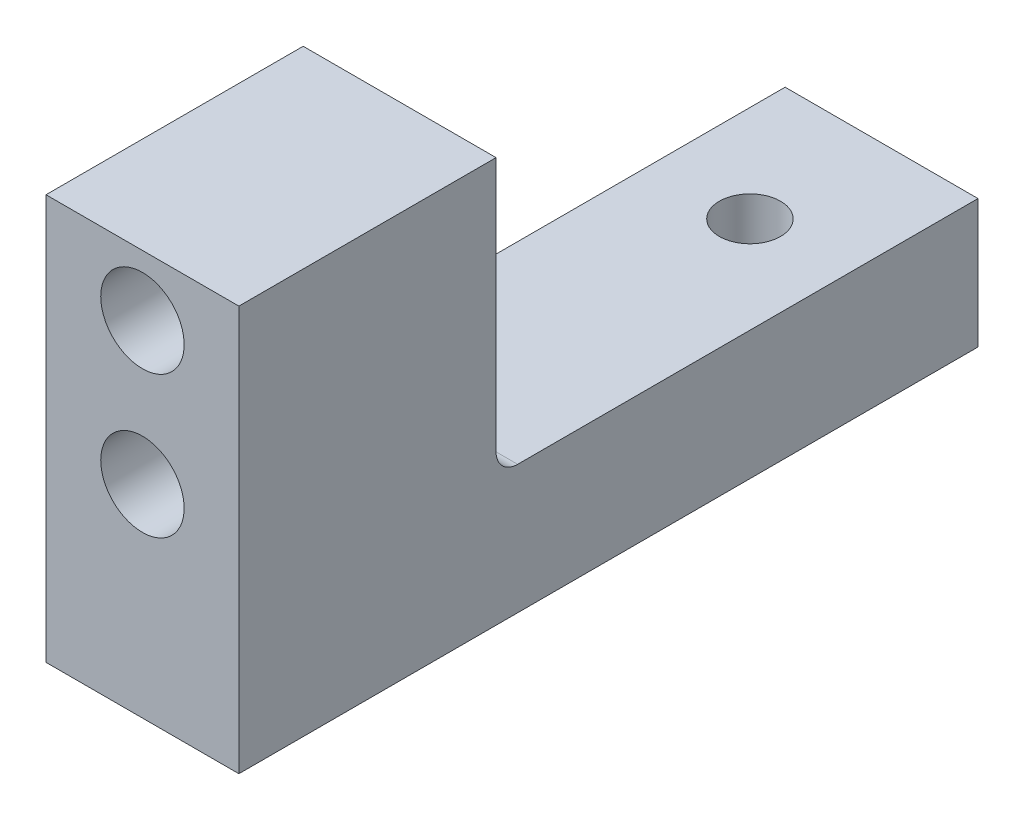
ISO-10303-21;
HEADER;
FILE_DESCRIPTION(('STEP AP214'),'2;1');
FILE_NAME('part.step','',(''),(''),'','','');
FILE_SCHEMA(('AUTOMOTIVE_DESIGN { 1 0 10303 214 1 1 1 1 }'));
ENDSEC;
DATA;
#1=APPLICATION_CONTEXT('core data for automotive mechanical design processes');
#2=APPLICATION_PROTOCOL_DEFINITION('international standard','automotive_design',2000,#1);
#3=PRODUCT_CONTEXT('',#1,'mechanical');
#4=PRODUCT('Part','Part','',(#3));
#5=PRODUCT_RELATED_PRODUCT_CATEGORY('part','',(#4));
#6=PRODUCT_DEFINITION_FORMATION('','',#4);
#7=PRODUCT_DEFINITION_CONTEXT('part definition',#1,'design');
#8=PRODUCT_DEFINITION('design','',#6,#7);
#9=PRODUCT_DEFINITION_SHAPE('','',#8);
#10=(LENGTH_UNIT() NAMED_UNIT(*) SI_UNIT(.MILLI.,.METRE.));
#11=(NAMED_UNIT(*) PLANE_ANGLE_UNIT() SI_UNIT($,.RADIAN.));
#12=(NAMED_UNIT(*) SI_UNIT($,.STERADIAN.) SOLID_ANGLE_UNIT());
#13=UNCERTAINTY_MEASURE_WITH_UNIT(LENGTH_MEASURE(1.E-05),#10,'distance_accuracy_value','');
#14=(GEOMETRIC_REPRESENTATION_CONTEXT(3) GLOBAL_UNCERTAINTY_ASSIGNED_CONTEXT((#13)) GLOBAL_UNIT_ASSIGNED_CONTEXT((#10,
#11,#12)) REPRESENTATION_CONTEXT('',''));
#15=CARTESIAN_POINT('',(0.,0.,0.));
#16=DIRECTION('',(0.,0.,1.));
#17=DIRECTION('',(1.,0.,0.));
#18=AXIS2_PLACEMENT_3D('',#15,#16,#17);
#19=CARTESIAN_POINT('',(4.7625,5.,-9.125));
#20=DIRECTION('',(0.,0.,1.));
#21=DIRECTION('',(1.,0.,0.));
#22=AXIS2_PLACEMENT_3D('',#19,#20,#21);
#23=PLANE('',#22);
#24=DIRECTION('',(0.,1.,0.));
#25=VECTOR('',#24,1.);
#26=CARTESIAN_POINT('',(0.,5.,-9.125));
#27=LINE('',#26,#25);
#28=CARTESIAN_POINT('',(0.,-5.,-9.125));
#29=VERTEX_POINT('',#28);
#30=CARTESIAN_POINT('',(0.,-1.825,-9.125));
#31=VERTEX_POINT('',#30);
#32=EDGE_CURVE('E128',#29,#31,#27,.T.);
#33=ORIENTED_EDGE('',*,*,#32,.T.);
#34=DIRECTION('',(1.,0.,0.));
#35=VECTOR('',#34,1.);
#36=CARTESIAN_POINT('',(-5.2375,-1.825,-9.125));
#37=LINE('',#36,#35);
#38=CARTESIAN_POINT('',(4.7625,-1.825,-9.125));
#39=VERTEX_POINT('',#38);
#40=EDGE_CURVE('E104',#31,#39,#37,.T.);
#41=ORIENTED_EDGE('',*,*,#40,.T.);
#42=DIRECTION('',(0.,1.,0.));
#43=VECTOR('',#42,1.);
#44=CARTESIAN_POINT('',(4.7625,5.,-9.125));
#45=LINE('',#44,#43);
#46=CARTESIAN_POINT('',(4.7625,-5.,-9.125));
#47=VERTEX_POINT('',#46);
#48=EDGE_CURVE('E117',#47,#39,#45,.T.);
#49=ORIENTED_EDGE('',*,*,#48,.F.);
#50=DIRECTION('',(-1.,0.,0.));
#51=VECTOR('',#50,1.);
#52=CARTESIAN_POINT('',(4.7625,-5.,-9.125));
#53=LINE('',#52,#51);
#54=EDGE_CURVE('E127',#47,#29,#53,.T.);
#55=ORIENTED_EDGE('',*,*,#54,.T.);
#56=EDGE_LOOP('',(#33,#41,#49,#55));
#57=FACE_BOUND('',#56,.T.);
#58=ADVANCED_FACE('F36',(#57),#23,.F.);
#59=CARTESIAN_POINT('',(4.7625,5.,9.125));
#60=DIRECTION('',(0.,-1.,0.));
#61=DIRECTION('',(0.,0.,-1.));
#62=AXIS2_PLACEMENT_3D('',#59,#60,#61);
#63=PLANE('',#62);
#64=DIRECTION('',(0.,0.,1.));
#65=VECTOR('',#64,1.);
#66=CARTESIAN_POINT('',(4.7625,5.,9.125));
#67=LINE('',#66,#65);
#68=CARTESIAN_POINT('',(4.7625,5.,2.775));
#69=VERTEX_POINT('',#68);
#70=CARTESIAN_POINT('',(4.7625,5.,9.125));
#71=VERTEX_POINT('',#70);
#72=EDGE_CURVE('E108',#69,#71,#67,.T.);
#73=ORIENTED_EDGE('',*,*,#72,.F.);
#74=DIRECTION('',(1.,0.,0.));
#75=VECTOR('',#74,1.);
#76=CARTESIAN_POINT('',(-5.2375,5.,2.775));
#77=LINE('',#76,#75);
#78=CARTESIAN_POINT('',(0.,5.,2.775));
#79=VERTEX_POINT('',#78);
#80=EDGE_CURVE('E97',#79,#69,#77,.T.);
#81=ORIENTED_EDGE('',*,*,#80,.F.);
#82=DIRECTION('',(0.,0.,1.));
#83=VECTOR('',#82,1.);
#84=CARTESIAN_POINT('',(0.,5.,9.125));
#85=LINE('',#84,#83);
#86=CARTESIAN_POINT('',(0.,5.,9.125));
#87=VERTEX_POINT('',#86);
#88=EDGE_CURVE('E131',#79,#87,#85,.T.);
#89=ORIENTED_EDGE('',*,*,#88,.T.);
#90=DIRECTION('',(-1.,0.,0.));
#91=VECTOR('',#90,1.);
#92=CARTESIAN_POINT('',(4.7625,5.,9.125));
#93=LINE('',#92,#91);
#94=EDGE_CURVE('E114',#71,#87,#93,.T.);
#95=ORIENTED_EDGE('',*,*,#94,.F.);
#96=EDGE_LOOP('',(#73,#81,#89,#95));
#97=FACE_BOUND('',#96,.T.);
#98=ADVANCED_FACE('F112',(#97),#63,.F.);
#99=CARTESIAN_POINT('',(4.7625,5.,9.125));
#100=DIRECTION('',(0.,0.,-1.));
#101=DIRECTION('',(0.,1.,0.));
#102=AXIS2_PLACEMENT_3D('',#99,#100,#101);
#103=PLANE('',#102);
#104=CARTESIAN_POINT('',(2.38125,0.,9.125));
#105=DIRECTION('',(0.,0.,-1.));
#106=DIRECTION('',(-1.,0.,0.));
#107=AXIS2_PLACEMENT_3D('',#104,#105,#106);
#108=CIRCLE('',#107,1.03);
#109=CARTESIAN_POINT('',(1.35125,0.,9.125));
#110=VERTEX_POINT('',#109);
#111=EDGE_CURVE('E161',#110,#110,#108,.T.);
#112=ORIENTED_EDGE('',*,*,#111,.T.);
#113=EDGE_LOOP('',(#112));
#114=FACE_BOUND('',#113,.T.);
#115=CARTESIAN_POINT('',(2.38125,3.5,9.125));
#116=DIRECTION('',(0.,0.,-1.));
#117=DIRECTION('',(-1.,0.,0.));
#118=AXIS2_PLACEMENT_3D('',#115,#116,#117);
#119=CIRCLE('',#118,1.03);
#120=CARTESIAN_POINT('',(1.35125,3.5,9.125));
#121=VERTEX_POINT('',#120);
#122=EDGE_CURVE('E153',#121,#121,#119,.T.);
#123=ORIENTED_EDGE('',*,*,#122,.T.);
#124=EDGE_LOOP('',(#123));
#125=FACE_BOUND('',#124,.T.);
#126=DIRECTION('',(0.,-1.,0.));
#127=VECTOR('',#126,1.);
#128=CARTESIAN_POINT('',(0.,5.,9.125));
#129=LINE('',#128,#127);
#130=CARTESIAN_POINT('',(0.,-5.,9.125));
#131=VERTEX_POINT('',#130);
#132=EDGE_CURVE('E134',#87,#131,#129,.T.);
#133=ORIENTED_EDGE('',*,*,#132,.T.);
#134=DIRECTION('',(-1.,0.,0.));
#135=VECTOR('',#134,1.);
#136=CARTESIAN_POINT('',(4.7625,-5.,9.125));
#137=LINE('',#136,#135);
#138=CARTESIAN_POINT('',(4.7625,-5.,9.125));
#139=VERTEX_POINT('',#138);
#140=EDGE_CURVE('E139',#139,#131,#137,.T.);
#141=ORIENTED_EDGE('',*,*,#140,.F.);
#142=DIRECTION('',(0.,-1.,0.));
#143=VECTOR('',#142,1.);
#144=CARTESIAN_POINT('',(4.7625,5.,9.125));
#145=LINE('',#144,#143);
#146=EDGE_CURVE('E116',#71,#139,#145,.T.);
#147=ORIENTED_EDGE('',*,*,#146,.F.);
#148=ORIENTED_EDGE('',*,*,#94,.T.);
#149=EDGE_LOOP('',(#133,#141,#147,#148));
#150=FACE_BOUND('',#149,.T.);
#151=ADVANCED_FACE('F181',(#114,#125,#150),#103,.F.);
#152=CARTESIAN_POINT('',(4.7625,-5.,9.125));
#153=DIRECTION('',(0.,1.,0.));
#154=DIRECTION('',(0.,0.,1.));
#155=AXIS2_PLACEMENT_3D('',#152,#153,#154);
#156=PLANE('',#155);
#157=CARTESIAN_POINT('',(2.38125,-5.,6.125));
#158=DIRECTION('',(0.,-1.,0.));
#159=DIRECTION('',(0.,0.,-1.));
#160=AXIS2_PLACEMENT_3D('',#157,#158,#159);
#161=CIRCLE('',#160,0.75565);
#162=CARTESIAN_POINT('',(2.38125,-5.,5.36935));
#163=VERTEX_POINT('',#162);
#164=EDGE_CURVE('E168',#163,#163,#161,.T.);
#165=ORIENTED_EDGE('',*,*,#164,.F.);
#166=EDGE_LOOP('',(#165));
#167=FACE_BOUND('',#166,.T.);
#168=CARTESIAN_POINT('',(2.38125,-5.,-5.875));
#169=DIRECTION('',(0.,-1.,0.));
#170=DIRECTION('',(0.,0.,-1.));
#171=AXIS2_PLACEMENT_3D('',#168,#169,#170);
#172=CIRCLE('',#171,0.75565);
#173=CARTESIAN_POINT('',(2.38125,-5.,-6.63065));
#174=VERTEX_POINT('',#173);
#175=EDGE_CURVE('E132',#174,#174,#172,.T.);
#176=ORIENTED_EDGE('',*,*,#175,.F.);
#177=EDGE_LOOP('',(#176));
#178=FACE_BOUND('',#177,.T.);
#179=DIRECTION('',(0.,0.,-1.));
#180=VECTOR('',#179,1.);
#181=CARTESIAN_POINT('',(0.,-5.,9.125));
#182=LINE('',#181,#180);
#183=EDGE_CURVE('E122',#131,#29,#182,.T.);
#184=ORIENTED_EDGE('',*,*,#183,.T.);
#185=ORIENTED_EDGE('',*,*,#54,.F.);
#186=DIRECTION('',(0.,0.,-1.));
#187=VECTOR('',#186,1.);
#188=CARTESIAN_POINT('',(4.7625,-5.,9.125));
#189=LINE('',#188,#187);
#190=EDGE_CURVE('E119',#139,#47,#189,.T.);
#191=ORIENTED_EDGE('',*,*,#190,.F.);
#192=ORIENTED_EDGE('',*,*,#140,.T.);
#193=EDGE_LOOP('',(#184,#185,#191,#192));
#194=FACE_BOUND('',#193,.T.);
#195=ADVANCED_FACE('F178',(#167,#178,#194),#156,.F.);
#196=CARTESIAN_POINT('',(4.7625,0.,0.));
#197=DIRECTION('',(1.,0.,0.));
#198=DIRECTION('',(0.,0.,-1.));
#199=AXIS2_PLACEMENT_3D('',#196,#197,#198);
#200=PLANE('',#199);
#201=DIRECTION('',(0.,0.,-1.));
#202=VECTOR('',#201,1.);
#203=CARTESIAN_POINT('',(4.7625,-1.825,-9.125));
#204=LINE('',#203,#202);
#205=CARTESIAN_POINT('',(4.7625,-1.825,2.2416));
#206=VERTEX_POINT('',#205);
#207=EDGE_CURVE('E105',#206,#39,#204,.T.);
#208=ORIENTED_EDGE('',*,*,#207,.F.);
#209=CARTESIAN_POINT('',(4.7625,-1.2916,2.2416));
#210=DIRECTION('',(1.,0.,0.));
#211=DIRECTION('',(0.,0.,-1.));
#212=AXIS2_PLACEMENT_3D('',#209,#210,#211);
#213=CIRCLE('',#212,0.5334);
#214=CARTESIAN_POINT('',(4.7625,-1.2916,2.775));
#215=VERTEX_POINT('',#214);
#216=EDGE_CURVE('E45',#206,#215,#213,.F.);
#217=ORIENTED_EDGE('',*,*,#216,.T.);
#218=DIRECTION('',(0.,-1.,0.));
#219=VECTOR('',#218,1.);
#220=CARTESIAN_POINT('',(4.7625,5.,2.775));
#221=LINE('',#220,#219);
#222=EDGE_CURVE('E99',#69,#215,#221,.T.);
#223=ORIENTED_EDGE('',*,*,#222,.F.);
#224=ORIENTED_EDGE('',*,*,#72,.T.);
#225=ORIENTED_EDGE('',*,*,#146,.T.);
#226=ORIENTED_EDGE('',*,*,#190,.T.);
#227=ORIENTED_EDGE('',*,*,#48,.T.);
#228=EDGE_LOOP('',(#208,#217,#223,#224,#225,#226,#227));
#229=FACE_BOUND('',#228,.T.);
#230=ADVANCED_FACE('F107',(#229),#200,.T.);
#231=CARTESIAN_POINT('',(0.,0.,0.));
#232=DIRECTION('',(1.,0.,0.));
#233=DIRECTION('',(0.,0.,-1.));
#234=AXIS2_PLACEMENT_3D('',#231,#232,#233);
#235=PLANE('',#234);
#236=DIRECTION('',(0.,-1.,0.));
#237=VECTOR('',#236,1.);
#238=CARTESIAN_POINT('',(0.,0.,2.775));
#239=LINE('',#238,#237);
#240=CARTESIAN_POINT('',(0.,-1.2916,2.775));
#241=VERTEX_POINT('',#240);
#242=EDGE_CURVE('E100',#79,#241,#239,.T.);
#243=ORIENTED_EDGE('',*,*,#242,.T.);
#244=CARTESIAN_POINT('',(0.,-1.2916,2.2416));
#245=DIRECTION('',(1.,0.,0.));
#246=DIRECTION('',(0.,0.,-1.));
#247=AXIS2_PLACEMENT_3D('',#244,#245,#246);
#248=CIRCLE('',#247,0.5334);
#249=CARTESIAN_POINT('',(0.,-1.825,2.2416));
#250=VERTEX_POINT('',#249);
#251=EDGE_CURVE('E12',#241,#250,#248,.T.);
#252=ORIENTED_EDGE('',*,*,#251,.T.);
#253=DIRECTION('',(0.,0.,-1.));
#254=VECTOR('',#253,1.);
#255=CARTESIAN_POINT('',(0.,-1.825,0.));
#256=LINE('',#255,#254);
#257=EDGE_CURVE('E146',#250,#31,#256,.T.);
#258=ORIENTED_EDGE('',*,*,#257,.T.);
#259=ORIENTED_EDGE('',*,*,#32,.F.);
#260=ORIENTED_EDGE('',*,*,#183,.F.);
#261=ORIENTED_EDGE('',*,*,#132,.F.);
#262=ORIENTED_EDGE('',*,*,#88,.F.);
#263=EDGE_LOOP('',(#243,#252,#258,#259,#260,#261,#262));
#264=FACE_BOUND('',#263,.T.);
#265=ADVANCED_FACE('F193',(#264),#235,.F.);
#266=CARTESIAN_POINT('',(2.38125,-5.,-5.875));
#267=DIRECTION('',(0.,-1.,0.));
#268=DIRECTION('',(0.,0.,-1.));
#269=AXIS2_PLACEMENT_3D('',#266,#267,#268);
#270=CYLINDRICAL_SURFACE('',#269,0.755649999999999);
#271=CARTESIAN_POINT('',(2.38125,-1.825,-5.875));
#272=DIRECTION('',(0.,-1.,0.));
#273=DIRECTION('',(0.,0.,-1.));
#274=AXIS2_PLACEMENT_3D('',#271,#272,#273);
#275=CIRCLE('',#274,0.755649999999999);
#276=CARTESIAN_POINT('',(2.38125,-1.825,-6.63065));
#277=VERTEX_POINT('',#276);
#278=EDGE_CURVE('E143',#277,#277,#275,.F.);
#279=ORIENTED_EDGE('',*,*,#278,.T.);
#280=EDGE_LOOP('',(#279));
#281=FACE_BOUND('',#280,.T.);
#282=ORIENTED_EDGE('',*,*,#175,.T.);
#283=EDGE_LOOP('',(#282));
#284=FACE_BOUND('',#283,.T.);
#285=ADVANCED_FACE('F176',(#281,#284),#270,.F.);
#286=CARTESIAN_POINT('',(2.38125,-1.5,6.125));
#287=DIRECTION('',(0.,-1.,0.));
#288=DIRECTION('',(0.,0.,-1.));
#289=AXIS2_PLACEMENT_3D('',#286,#287,#288);
#290=CONICAL_SURFACE('',#289,0.755649999999999,1.02974425867665);
#291=CARTESIAN_POINT('',(2.38125,-1.04595967323182,6.125));
#292=VERTEX_POINT('',#291);
#293=VERTEX_LOOP('',#292);
#294=FACE_BOUND('',#293,.T.);
#295=CARTESIAN_POINT('',(2.38125,-1.5,6.125));
#296=DIRECTION('',(0.,-1.,0.));
#297=DIRECTION('',(0.,0.,-1.));
#298=AXIS2_PLACEMENT_3D('',#295,#296,#297);
#299=CIRCLE('',#298,0.755649999999999);
#300=CARTESIAN_POINT('',(2.38125,-1.5,5.36935));
#301=VERTEX_POINT('',#300);
#302=EDGE_CURVE('E171',#301,#301,#299,.T.);
#303=ORIENTED_EDGE('',*,*,#302,.T.);
#304=EDGE_LOOP('',(#303));
#305=FACE_BOUND('',#304,.T.);
#306=ADVANCED_FACE('F228',(#294,#305),#290,.F.);
#307=CARTESIAN_POINT('',(2.38125,-5.,6.125));
#308=DIRECTION('',(0.,-1.,0.));
#309=DIRECTION('',(0.,0.,-1.));
#310=AXIS2_PLACEMENT_3D('',#307,#308,#309);
#311=CYLINDRICAL_SURFACE('',#310,0.755649999999999);
#312=ORIENTED_EDGE('',*,*,#302,.F.);
#313=EDGE_LOOP('',(#312));
#314=FACE_BOUND('',#313,.T.);
#315=ORIENTED_EDGE('',*,*,#164,.T.);
#316=EDGE_LOOP('',(#315));
#317=FACE_BOUND('',#316,.T.);
#318=ADVANCED_FACE('F232',(#314,#317),#311,.F.);
#319=CARTESIAN_POINT('',(-5.2375,5.,2.775));
#320=DIRECTION('',(0.,0.,1.));
#321=DIRECTION('',(1.,0.,0.));
#322=AXIS2_PLACEMENT_3D('',#319,#320,#321);
#323=PLANE('',#322);
#324=CARTESIAN_POINT('',(2.38125,0.,2.775));
#325=DIRECTION('',(0.,0.,1.));
#326=DIRECTION('',(1.,0.,0.));
#327=AXIS2_PLACEMENT_3D('',#324,#325,#326);
#328=CIRCLE('',#327,1.03);
#329=CARTESIAN_POINT('',(3.41125,0.,2.775));
#330=VERTEX_POINT('',#329);
#331=EDGE_CURVE('E40',#330,#330,#328,.T.);
#332=ORIENTED_EDGE('',*,*,#331,.T.);
#333=EDGE_LOOP('',(#332));
#334=FACE_BOUND('',#333,.T.);
#335=CARTESIAN_POINT('',(2.38125,3.5,2.775));
#336=DIRECTION('',(0.,0.,1.));
#337=DIRECTION('',(1.,0.,0.));
#338=AXIS2_PLACEMENT_3D('',#335,#336,#337);
#339=CIRCLE('',#338,1.03);
#340=CARTESIAN_POINT('',(3.41125,3.5,2.775));
#341=VERTEX_POINT('',#340);
#342=EDGE_CURVE('E110',#341,#341,#339,.T.);
#343=ORIENTED_EDGE('',*,*,#342,.T.);
#344=EDGE_LOOP('',(#343));
#345=FACE_BOUND('',#344,.T.);
#346=ORIENTED_EDGE('',*,*,#222,.T.);
#347=DIRECTION('',(1.,0.,0.));
#348=VECTOR('',#347,1.);
#349=CARTESIAN_POINT('',(0.,-1.2916,2.775));
#350=LINE('',#349,#348);
#351=EDGE_CURVE('E53',#215,#241,#350,.F.);
#352=ORIENTED_EDGE('',*,*,#351,.T.);
#353=ORIENTED_EDGE('',*,*,#242,.F.);
#354=ORIENTED_EDGE('',*,*,#80,.T.);
#355=EDGE_LOOP('',(#346,#352,#353,#354));
#356=FACE_BOUND('',#355,.T.);
#357=ADVANCED_FACE('F98',(#334,#345,#356),#323,.F.);
#358=CARTESIAN_POINT('',(-5.2375,-1.825,-9.125));
#359=DIRECTION('',(0.,-1.,0.));
#360=DIRECTION('',(0.,0.,-1.));
#361=AXIS2_PLACEMENT_3D('',#358,#359,#360);
#362=PLANE('',#361);
#363=ORIENTED_EDGE('',*,*,#278,.F.);
#364=EDGE_LOOP('',(#363));
#365=FACE_BOUND('',#364,.T.);
#366=ORIENTED_EDGE('',*,*,#257,.F.);
#367=DIRECTION('',(1.,0.,0.));
#368=VECTOR('',#367,1.);
#369=CARTESIAN_POINT('',(4.7625,-1.825,2.2416));
#370=LINE('',#369,#368);
#371=EDGE_CURVE('E148',#250,#206,#370,.T.);
#372=ORIENTED_EDGE('',*,*,#371,.T.);
#373=ORIENTED_EDGE('',*,*,#207,.T.);
#374=ORIENTED_EDGE('',*,*,#40,.F.);
#375=EDGE_LOOP('',(#366,#372,#373,#374));
#376=FACE_BOUND('',#375,.T.);
#377=ADVANCED_FACE('F199',(#365,#376),#362,.F.);
#378=CARTESIAN_POINT('',(-5.2375,-1.2916,2.2416));
#379=DIRECTION('',(-1.,0.,0.));
#380=DIRECTION('',(0.,0.,1.));
#381=AXIS2_PLACEMENT_3D('',#378,#379,#380);
#382=CYLINDRICAL_SURFACE('',#381,0.5334);
#383=ORIENTED_EDGE('',*,*,#251,.F.);
#384=ORIENTED_EDGE('',*,*,#351,.F.);
#385=ORIENTED_EDGE('',*,*,#216,.F.);
#386=ORIENTED_EDGE('',*,*,#371,.F.);
#387=EDGE_LOOP('',(#383,#384,#385,#386));
#388=FACE_BOUND('',#387,.T.);
#389=ADVANCED_FACE('F38',(#388),#382,.F.);
#390=CARTESIAN_POINT('',(2.38125,3.5,9.125));
#391=DIRECTION('',(0.,0.,-1.));
#392=DIRECTION('',(-1.,0.,0.));
#393=AXIS2_PLACEMENT_3D('',#390,#391,#392);
#394=CYLINDRICAL_SURFACE('',#393,1.03);
#395=ORIENTED_EDGE('',*,*,#122,.F.);
#396=EDGE_LOOP('',(#395));
#397=FACE_BOUND('',#396,.T.);
#398=ORIENTED_EDGE('',*,*,#342,.F.);
#399=EDGE_LOOP('',(#398));
#400=FACE_BOUND('',#399,.T.);
#401=ADVANCED_FACE('F203',(#397,#400),#394,.F.);
#402=CARTESIAN_POINT('',(2.38125,0.,9.125));
#403=DIRECTION('',(0.,0.,-1.));
#404=DIRECTION('',(-1.,0.,0.));
#405=AXIS2_PLACEMENT_3D('',#402,#403,#404);
#406=CYLINDRICAL_SURFACE('',#405,1.03);
#407=ORIENTED_EDGE('',*,*,#111,.F.);
#408=EDGE_LOOP('',(#407));
#409=FACE_BOUND('',#408,.T.);
#410=ORIENTED_EDGE('',*,*,#331,.F.);
#411=EDGE_LOOP('',(#410));
#412=FACE_BOUND('',#411,.T.);
#413=ADVANCED_FACE('F208',(#409,#412),#406,.F.);
#414=CLOSED_SHELL('',(#58,#98,#151,#195,#230,#265,#285,#306,#318,#357,#377,#389,#401,#413));
#415=MANIFOLD_SOLID_BREP('B2',#414);
#416=ADVANCED_BREP_SHAPE_REPRESENTATION('',(#18,#415),#14);
#417=SHAPE_DEFINITION_REPRESENTATION(#9,#416);
ENDSEC;
END-ISO-10303-21;
